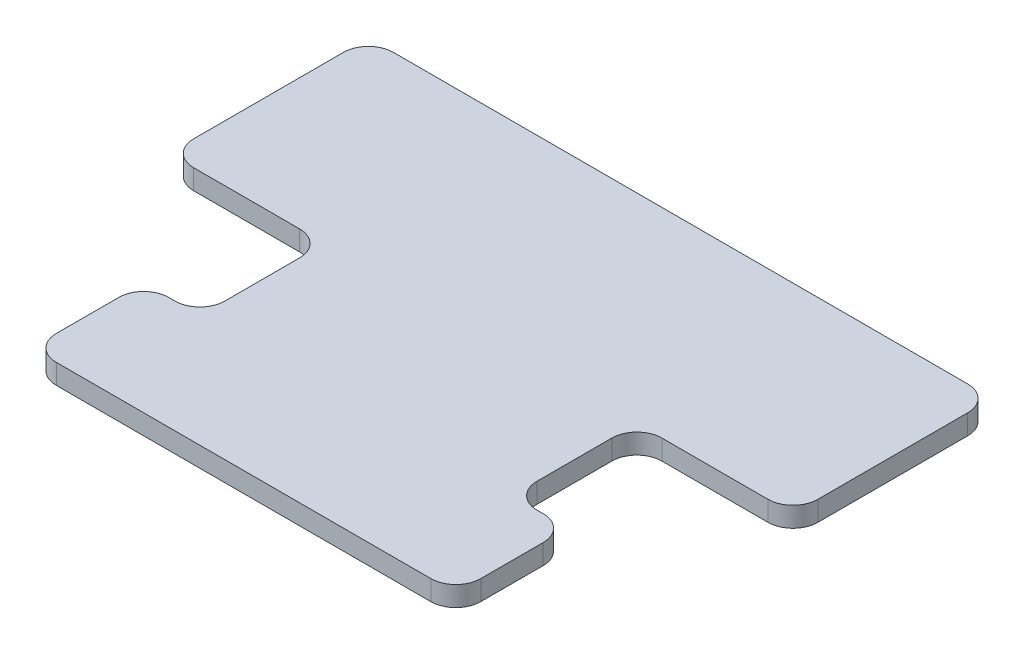
ISO-10303-21;
HEADER;
FILE_DESCRIPTION(('STEP AP214'),'2;1');
FILE_NAME('part.step','',(''),(''),'','','');
FILE_SCHEMA(('AUTOMOTIVE_DESIGN { 1 0 10303 214 1 1 1 1 }'));
ENDSEC;
DATA;
#1=APPLICATION_CONTEXT('core data for automotive mechanical design processes');
#2=APPLICATION_PROTOCOL_DEFINITION('international standard','automotive_design',2000,#1);
#3=PRODUCT_CONTEXT('',#1,'mechanical');
#4=PRODUCT('Part','Part','',(#3));
#5=PRODUCT_RELATED_PRODUCT_CATEGORY('part','',(#4));
#6=PRODUCT_DEFINITION_FORMATION('','',#4);
#7=PRODUCT_DEFINITION_CONTEXT('part definition',#1,'design');
#8=PRODUCT_DEFINITION('design','',#6,#7);
#9=PRODUCT_DEFINITION_SHAPE('','',#8);
#10=(LENGTH_UNIT() NAMED_UNIT(*) SI_UNIT(.MILLI.,.METRE.));
#11=(NAMED_UNIT(*) PLANE_ANGLE_UNIT() SI_UNIT($,.RADIAN.));
#12=(NAMED_UNIT(*) SI_UNIT($,.STERADIAN.) SOLID_ANGLE_UNIT());
#13=UNCERTAINTY_MEASURE_WITH_UNIT(LENGTH_MEASURE(1.E-05),#10,'distance_accuracy_value','');
#14=(GEOMETRIC_REPRESENTATION_CONTEXT(3) GLOBAL_UNCERTAINTY_ASSIGNED_CONTEXT((#13)) GLOBAL_UNIT_ASSIGNED_CONTEXT((#10,
#11,#12)) REPRESENTATION_CONTEXT('',''));
#15=CARTESIAN_POINT('',(0.,0.,0.));
#16=DIRECTION('',(0.,0.,1.));
#17=DIRECTION('',(1.,0.,0.));
#18=AXIS2_PLACEMENT_3D('',#15,#16,#17);
#19=CARTESIAN_POINT('',(-23.,1.6,-1.97350532717822));
#20=DIRECTION('',(0.,-1.,0.));
#21=DIRECTION('',(0.,0.,-1.));
#22=AXIS2_PLACEMENT_3D('',#19,#20,#21);
#23=CYLINDRICAL_SURFACE('',#22,2.);
#24=CARTESIAN_POINT('',(-23.,0.,-1.97350532717822));
#25=DIRECTION('',(0.,1.,0.));
#26=DIRECTION('',(0.,0.,1.));
#27=AXIS2_PLACEMENT_3D('',#24,#25,#26);
#28=CIRCLE('',#27,2.);
#29=CARTESIAN_POINT('',(-25.,0.,-1.97350532717822));
#30=VERTEX_POINT('',#29);
#31=CARTESIAN_POINT('',(-23.,0.,0.0264946728217795));
#32=VERTEX_POINT('',#31);
#33=EDGE_CURVE('E239',#30,#32,#28,.T.);
#34=ORIENTED_EDGE('',*,*,#33,.T.);
#35=DIRECTION('',(0.,-1.,0.));
#36=VECTOR('',#35,1.);
#37=CARTESIAN_POINT('',(-23.,1.6,0.0264946728217795));
#38=LINE('',#37,#36);
#39=CARTESIAN_POINT('',(-23.,1.6,0.0264946728217795));
#40=VERTEX_POINT('',#39);
#41=EDGE_CURVE('E11',#40,#32,#38,.T.);
#42=ORIENTED_EDGE('',*,*,#41,.F.);
#43=CARTESIAN_POINT('',(-23.,1.6,-1.97350532717822));
#44=DIRECTION('',(0.,1.,0.));
#45=DIRECTION('',(0.,0.,1.));
#46=AXIS2_PLACEMENT_3D('',#43,#44,#45);
#47=CIRCLE('',#46,2.);
#48=CARTESIAN_POINT('',(-25.,1.6,-1.97350532717822));
#49=VERTEX_POINT('',#48);
#50=EDGE_CURVE('E320',#49,#40,#47,.T.);
#51=ORIENTED_EDGE('',*,*,#50,.F.);
#52=DIRECTION('',(0.,-1.,0.));
#53=VECTOR('',#52,1.);
#54=CARTESIAN_POINT('',(-25.,1.6,-1.97350532717822));
#55=LINE('',#54,#53);
#56=EDGE_CURVE('E238',#49,#30,#55,.T.);
#57=ORIENTED_EDGE('',*,*,#56,.T.);
#58=EDGE_LOOP('',(#34,#42,#51,#57));
#59=FACE_BOUND('',#58,.T.);
#60=ADVANCED_FACE('F37',(#59),#23,.T.);
#61=CARTESIAN_POINT('',(-23.,1.6,0.0264946728217795));
#62=DIRECTION('',(0.,0.,-1.));
#63=DIRECTION('',(-1.,0.,0.));
#64=AXIS2_PLACEMENT_3D('',#61,#62,#63);
#65=PLANE('',#64);
#66=DIRECTION('',(1.,0.,0.));
#67=VECTOR('',#66,1.);
#68=CARTESIAN_POINT('',(-23.,0.,0.0264946728217795));
#69=LINE('',#68,#67);
#70=CARTESIAN_POINT('',(-14.5,0.,0.0264946728217793));
#71=VERTEX_POINT('',#70);
#72=EDGE_CURVE('E243',#32,#71,#69,.T.);
#73=ORIENTED_EDGE('',*,*,#72,.T.);
#74=DIRECTION('',(0.,-1.,0.));
#75=VECTOR('',#74,1.);
#76=CARTESIAN_POINT('',(-14.5,1.6,0.0264946728217793));
#77=LINE('',#76,#75);
#78=CARTESIAN_POINT('',(-14.5,1.6,0.0264946728217793));
#79=VERTEX_POINT('',#78);
#80=EDGE_CURVE('E46',#79,#71,#77,.T.);
#81=ORIENTED_EDGE('',*,*,#80,.F.);
#82=DIRECTION('',(1.,0.,0.));
#83=VECTOR('',#82,1.);
#84=CARTESIAN_POINT('',(-23.,1.6,0.0264946728217795));
#85=LINE('',#84,#83);
#86=EDGE_CURVE('E144',#40,#79,#85,.T.);
#87=ORIENTED_EDGE('',*,*,#86,.F.);
#88=ORIENTED_EDGE('',*,*,#41,.T.);
#89=EDGE_LOOP('',(#73,#81,#87,#88));
#90=FACE_BOUND('',#89,.T.);
#91=ADVANCED_FACE('F487',(#90),#65,.F.);
#92=CARTESIAN_POINT('',(-14.5,1.6,2.02649467282178));
#93=DIRECTION('',(0.,-1.,0.));
#94=DIRECTION('',(0.,0.,-1.));
#95=AXIS2_PLACEMENT_3D('',#92,#93,#94);
#96=CYLINDRICAL_SURFACE('',#95,2.);
#97=CARTESIAN_POINT('',(-14.5,0.,2.02649467282178));
#98=DIRECTION('',(0.,-1.,0.));
#99=DIRECTION('',(0.,0.,-1.));
#100=AXIS2_PLACEMENT_3D('',#97,#98,#99);
#101=CIRCLE('',#100,2.);
#102=CARTESIAN_POINT('',(-12.5,0.,2.02649467282178));
#103=VERTEX_POINT('',#102);
#104=EDGE_CURVE('E245',#71,#103,#101,.T.);
#105=ORIENTED_EDGE('',*,*,#104,.T.);
#106=DIRECTION('',(0.,-1.,0.));
#107=VECTOR('',#106,1.);
#108=CARTESIAN_POINT('',(-12.5,1.6,2.02649467282178));
#109=LINE('',#108,#107);
#110=CARTESIAN_POINT('',(-12.5,1.6,2.02649467282178));
#111=VERTEX_POINT('',#110);
#112=EDGE_CURVE('E384',#111,#103,#109,.T.);
#113=ORIENTED_EDGE('',*,*,#112,.F.);
#114=CARTESIAN_POINT('',(-14.5,1.6,2.02649467282178));
#115=DIRECTION('',(0.,-1.,0.));
#116=DIRECTION('',(0.,0.,-1.));
#117=AXIS2_PLACEMENT_3D('',#114,#115,#116);
#118=CIRCLE('',#117,2.);
#119=EDGE_CURVE('E395',#79,#111,#118,.T.);
#120=ORIENTED_EDGE('',*,*,#119,.F.);
#121=ORIENTED_EDGE('',*,*,#80,.T.);
#122=EDGE_LOOP('',(#105,#113,#120,#121));
#123=FACE_BOUND('',#122,.T.);
#124=ADVANCED_FACE('F393',(#123),#96,.F.);
#125=CARTESIAN_POINT('',(-12.5,1.6,2.02649467282178));
#126=DIRECTION('',(1.,0.,0.));
#127=DIRECTION('',(0.,0.,-1.));
#128=AXIS2_PLACEMENT_3D('',#125,#126,#127);
#129=PLANE('',#128);
#130=DIRECTION('',(0.,0.,1.));
#131=VECTOR('',#130,1.);
#132=CARTESIAN_POINT('',(-12.5,0.,2.02649467282178));
#133=LINE('',#132,#131);
#134=CARTESIAN_POINT('',(-12.5,0.,8.02649467282177));
#135=VERTEX_POINT('',#134);
#136=EDGE_CURVE('E248',#103,#135,#133,.T.);
#137=ORIENTED_EDGE('',*,*,#136,.T.);
#138=DIRECTION('',(0.,-1.,0.));
#139=VECTOR('',#138,1.);
#140=CARTESIAN_POINT('',(-12.5,1.6,8.02649467282177));
#141=LINE('',#140,#139);
#142=CARTESIAN_POINT('',(-12.5,1.6,8.02649467282177));
#143=VERTEX_POINT('',#142);
#144=EDGE_CURVE('E380',#143,#135,#141,.T.);
#145=ORIENTED_EDGE('',*,*,#144,.F.);
#146=DIRECTION('',(0.,0.,1.));
#147=VECTOR('',#146,1.);
#148=CARTESIAN_POINT('',(-12.5,1.6,2.02649467282178));
#149=LINE('',#148,#147);
#150=EDGE_CURVE('E414',#111,#143,#149,.T.);
#151=ORIENTED_EDGE('',*,*,#150,.F.);
#152=ORIENTED_EDGE('',*,*,#112,.T.);
#153=EDGE_LOOP('',(#137,#145,#151,#152));
#154=FACE_BOUND('',#153,.T.);
#155=ADVANCED_FACE('F403',(#154),#129,.F.);
#156=CARTESIAN_POINT('',(-14.5,1.6,8.02649467282178));
#157=DIRECTION('',(0.,-1.,0.));
#158=DIRECTION('',(0.,0.,-1.));
#159=AXIS2_PLACEMENT_3D('',#156,#157,#158);
#160=CYLINDRICAL_SURFACE('',#159,2.);
#161=CARTESIAN_POINT('',(-14.5,0.,8.02649467282178));
#162=DIRECTION('',(0.,-1.,0.));
#163=DIRECTION('',(0.,0.,-1.));
#164=AXIS2_PLACEMENT_3D('',#161,#162,#163);
#165=CIRCLE('',#164,2.);
#166=CARTESIAN_POINT('',(-14.5,0.,10.0264946728218));
#167=VERTEX_POINT('',#166);
#168=EDGE_CURVE('E251',#135,#167,#165,.T.);
#169=ORIENTED_EDGE('',*,*,#168,.T.);
#170=DIRECTION('',(0.,-1.,0.));
#171=VECTOR('',#170,1.);
#172=CARTESIAN_POINT('',(-14.5,1.6,10.0264946728218));
#173=LINE('',#172,#171);
#174=CARTESIAN_POINT('',(-14.5,1.6,10.0264946728218));
#175=VERTEX_POINT('',#174);
#176=EDGE_CURVE('E377',#175,#167,#173,.T.);
#177=ORIENTED_EDGE('',*,*,#176,.F.);
#178=CARTESIAN_POINT('',(-14.5,1.6,8.02649467282178));
#179=DIRECTION('',(0.,-1.,0.));
#180=DIRECTION('',(0.,0.,-1.));
#181=AXIS2_PLACEMENT_3D('',#178,#179,#180);
#182=CIRCLE('',#181,2.);
#183=EDGE_CURVE('E409',#143,#175,#182,.T.);
#184=ORIENTED_EDGE('',*,*,#183,.F.);
#185=ORIENTED_EDGE('',*,*,#144,.T.);
#186=EDGE_LOOP('',(#169,#177,#184,#185));
#187=FACE_BOUND('',#186,.T.);
#188=ADVANCED_FACE('F407',(#187),#160,.F.);
#189=CARTESIAN_POINT('',(-15.,1.6,10.0264946728218));
#190=DIRECTION('',(0.,0.,-1.));
#191=DIRECTION('',(-1.,0.,0.));
#192=AXIS2_PLACEMENT_3D('',#189,#190,#191);
#193=PLANE('',#192);
#194=DIRECTION('',(1.,0.,0.));
#195=VECTOR('',#194,1.);
#196=CARTESIAN_POINT('',(-15.,0.,10.0264946728218));
#197=LINE('',#196,#195);
#198=CARTESIAN_POINT('',(-15.,0.,10.0264946728218));
#199=VERTEX_POINT('',#198);
#200=EDGE_CURVE('E255',#199,#167,#197,.T.);
#201=ORIENTED_EDGE('',*,*,#200,.F.);
#202=DIRECTION('',(0.,-1.,0.));
#203=VECTOR('',#202,1.);
#204=CARTESIAN_POINT('',(-15.,1.6,10.0264946728218));
#205=LINE('',#204,#203);
#206=CARTESIAN_POINT('',(-15.,1.6,10.0264946728218));
#207=VERTEX_POINT('',#206);
#208=EDGE_CURVE('E374',#207,#199,#205,.T.);
#209=ORIENTED_EDGE('',*,*,#208,.F.);
#210=DIRECTION('',(1.,0.,0.));
#211=VECTOR('',#210,1.);
#212=CARTESIAN_POINT('',(-15.,1.6,10.0264946728218));
#213=LINE('',#212,#211);
#214=EDGE_CURVE('E413',#207,#175,#213,.T.);
#215=ORIENTED_EDGE('',*,*,#214,.T.);
#216=ORIENTED_EDGE('',*,*,#176,.T.);
#217=EDGE_LOOP('',(#201,#209,#215,#216));
#218=FACE_BOUND('',#217,.T.);
#219=ADVANCED_FACE('F500',(#218),#193,.T.);
#220=CARTESIAN_POINT('',(-15.,1.6,12.0264946728218));
#221=DIRECTION('',(0.,-1.,0.));
#222=DIRECTION('',(0.,0.,-1.));
#223=AXIS2_PLACEMENT_3D('',#220,#221,#222);
#224=CYLINDRICAL_SURFACE('',#223,2.);
#225=CARTESIAN_POINT('',(-15.,0.,12.0264946728218));
#226=DIRECTION('',(0.,1.,0.));
#227=DIRECTION('',(0.,0.,1.));
#228=AXIS2_PLACEMENT_3D('',#225,#226,#227);
#229=CIRCLE('',#228,2.);
#230=CARTESIAN_POINT('',(-17.,0.,12.0264946728218));
#231=VERTEX_POINT('',#230);
#232=EDGE_CURVE('E259',#199,#231,#229,.T.);
#233=ORIENTED_EDGE('',*,*,#232,.T.);
#234=DIRECTION('',(0.,-1.,0.));
#235=VECTOR('',#234,1.);
#236=CARTESIAN_POINT('',(-17.,1.6,12.0264946728218));
#237=LINE('',#236,#235);
#238=CARTESIAN_POINT('',(-17.,1.6,12.0264946728218));
#239=VERTEX_POINT('',#238);
#240=EDGE_CURVE('E370',#239,#231,#237,.T.);
#241=ORIENTED_EDGE('',*,*,#240,.F.);
#242=CARTESIAN_POINT('',(-15.,1.6,12.0264946728218));
#243=DIRECTION('',(0.,1.,0.));
#244=DIRECTION('',(0.,0.,1.));
#245=AXIS2_PLACEMENT_3D('',#242,#243,#244);
#246=CIRCLE('',#245,2.);
#247=EDGE_CURVE('E418',#207,#239,#246,.T.);
#248=ORIENTED_EDGE('',*,*,#247,.F.);
#249=ORIENTED_EDGE('',*,*,#208,.T.);
#250=EDGE_LOOP('',(#233,#241,#248,#249));
#251=FACE_BOUND('',#250,.T.);
#252=ADVANCED_FACE('F503',(#251),#224,.T.);
#253=CARTESIAN_POINT('',(-17.,1.6,12.0264946728218));
#254=DIRECTION('',(1.,0.,0.));
#255=DIRECTION('',(0.,0.,-1.));
#256=AXIS2_PLACEMENT_3D('',#253,#254,#255);
#257=PLANE('',#256);
#258=DIRECTION('',(0.,0.,1.));
#259=VECTOR('',#258,1.);
#260=CARTESIAN_POINT('',(-17.,0.,12.0264946728218));
#261=LINE('',#260,#259);
#262=CARTESIAN_POINT('',(-17.,0.,17.0264946728218));
#263=VERTEX_POINT('',#262);
#264=EDGE_CURVE('E262',#231,#263,#261,.T.);
#265=ORIENTED_EDGE('',*,*,#264,.T.);
#266=DIRECTION('',(0.,-1.,0.));
#267=VECTOR('',#266,1.);
#268=CARTESIAN_POINT('',(-17.,1.6,17.0264946728218));
#269=LINE('',#268,#267);
#270=CARTESIAN_POINT('',(-17.,1.6,17.0264946728218));
#271=VERTEX_POINT('',#270);
#272=EDGE_CURVE('E366',#271,#263,#269,.T.);
#273=ORIENTED_EDGE('',*,*,#272,.F.);
#274=DIRECTION('',(0.,0.,1.));
#275=VECTOR('',#274,1.);
#276=CARTESIAN_POINT('',(-17.,1.6,12.0264946728218));
#277=LINE('',#276,#275);
#278=EDGE_CURVE('E426',#239,#271,#277,.T.);
#279=ORIENTED_EDGE('',*,*,#278,.F.);
#280=ORIENTED_EDGE('',*,*,#240,.T.);
#281=EDGE_LOOP('',(#265,#273,#279,#280));
#282=FACE_BOUND('',#281,.T.);
#283=ADVANCED_FACE('F507',(#282),#257,.F.);
#284=CARTESIAN_POINT('',(-15.,1.6,17.0264946728218));
#285=DIRECTION('',(0.,-1.,0.));
#286=DIRECTION('',(0.,0.,-1.));
#287=AXIS2_PLACEMENT_3D('',#284,#285,#286);
#288=CYLINDRICAL_SURFACE('',#287,2.);
#289=CARTESIAN_POINT('',(-15.,0.,17.0264946728218));
#290=DIRECTION('',(0.,1.,0.));
#291=DIRECTION('',(0.,0.,1.));
#292=AXIS2_PLACEMENT_3D('',#289,#290,#291);
#293=CIRCLE('',#292,2.);
#294=CARTESIAN_POINT('',(-15.,0.,19.0264946728218));
#295=VERTEX_POINT('',#294);
#296=EDGE_CURVE('E265',#263,#295,#293,.T.);
#297=ORIENTED_EDGE('',*,*,#296,.T.);
#298=DIRECTION('',(0.,-1.,0.));
#299=VECTOR('',#298,1.);
#300=CARTESIAN_POINT('',(-15.,1.6,19.0264946728218));
#301=LINE('',#300,#299);
#302=CARTESIAN_POINT('',(-15.,1.6,19.0264946728218));
#303=VERTEX_POINT('',#302);
#304=EDGE_CURVE('E362',#303,#295,#301,.T.);
#305=ORIENTED_EDGE('',*,*,#304,.F.);
#306=CARTESIAN_POINT('',(-15.,1.6,17.0264946728218));
#307=DIRECTION('',(0.,1.,0.));
#308=DIRECTION('',(0.,0.,1.));
#309=AXIS2_PLACEMENT_3D('',#306,#307,#308);
#310=CIRCLE('',#309,2.);
#311=EDGE_CURVE('E429',#271,#303,#310,.T.);
#312=ORIENTED_EDGE('',*,*,#311,.F.);
#313=ORIENTED_EDGE('',*,*,#272,.T.);
#314=EDGE_LOOP('',(#297,#305,#312,#313));
#315=FACE_BOUND('',#314,.T.);
#316=ADVANCED_FACE('F511',(#315),#288,.T.);
#317=CARTESIAN_POINT('',(-15.,1.6,19.0264946728218));
#318=DIRECTION('',(0.,0.,-1.));
#319=DIRECTION('',(-1.,0.,0.));
#320=AXIS2_PLACEMENT_3D('',#317,#318,#319);
#321=PLANE('',#320);
#322=DIRECTION('',(1.,0.,0.));
#323=VECTOR('',#322,1.);
#324=CARTESIAN_POINT('',(-15.,0.,19.0264946728218));
#325=LINE('',#324,#323);
#326=CARTESIAN_POINT('',(15.,0.,19.0264946728218));
#327=VERTEX_POINT('',#326);
#328=EDGE_CURVE('E268',#295,#327,#325,.T.);
#329=ORIENTED_EDGE('',*,*,#328,.T.);
#330=DIRECTION('',(0.,-1.,0.));
#331=VECTOR('',#330,1.);
#332=CARTESIAN_POINT('',(15.,1.6,19.0264946728218));
#333=LINE('',#332,#331);
#334=CARTESIAN_POINT('',(15.,1.6,19.0264946728218));
#335=VERTEX_POINT('',#334);
#336=EDGE_CURVE('E358',#335,#327,#333,.T.);
#337=ORIENTED_EDGE('',*,*,#336,.F.);
#338=DIRECTION('',(1.,0.,0.));
#339=VECTOR('',#338,1.);
#340=CARTESIAN_POINT('',(-15.,1.6,19.0264946728218));
#341=LINE('',#340,#339);
#342=EDGE_CURVE('E431',#303,#335,#341,.T.);
#343=ORIENTED_EDGE('',*,*,#342,.F.);
#344=ORIENTED_EDGE('',*,*,#304,.T.);
#345=EDGE_LOOP('',(#329,#337,#343,#344));
#346=FACE_BOUND('',#345,.T.);
#347=ADVANCED_FACE('F515',(#346),#321,.F.);
#348=CARTESIAN_POINT('',(15.,1.6,17.0264946728218));
#349=DIRECTION('',(0.,-1.,0.));
#350=DIRECTION('',(0.,0.,-1.));
#351=AXIS2_PLACEMENT_3D('',#348,#349,#350);
#352=CYLINDRICAL_SURFACE('',#351,2.);
#353=CARTESIAN_POINT('',(15.,0.,17.0264946728218));
#354=DIRECTION('',(0.,1.,0.));
#355=DIRECTION('',(0.,0.,1.));
#356=AXIS2_PLACEMENT_3D('',#353,#354,#355);
#357=CIRCLE('',#356,2.);
#358=CARTESIAN_POINT('',(17.,0.,17.0264946728218));
#359=VERTEX_POINT('',#358);
#360=EDGE_CURVE('E271',#327,#359,#357,.T.);
#361=ORIENTED_EDGE('',*,*,#360,.T.);
#362=DIRECTION('',(0.,-1.,0.));
#363=VECTOR('',#362,1.);
#364=CARTESIAN_POINT('',(17.,1.6,17.0264946728218));
#365=LINE('',#364,#363);
#366=CARTESIAN_POINT('',(17.,1.6,17.0264946728218));
#367=VERTEX_POINT('',#366);
#368=EDGE_CURVE('E355',#367,#359,#365,.T.);
#369=ORIENTED_EDGE('',*,*,#368,.F.);
#370=CARTESIAN_POINT('',(15.,1.6,17.0264946728218));
#371=DIRECTION('',(0.,1.,0.));
#372=DIRECTION('',(0.,0.,1.));
#373=AXIS2_PLACEMENT_3D('',#370,#371,#372);
#374=CIRCLE('',#373,2.);
#375=EDGE_CURVE('E434',#335,#367,#374,.T.);
#376=ORIENTED_EDGE('',*,*,#375,.F.);
#377=ORIENTED_EDGE('',*,*,#336,.T.);
#378=EDGE_LOOP('',(#361,#369,#376,#377));
#379=FACE_BOUND('',#378,.T.);
#380=ADVANCED_FACE('F519',(#379),#352,.T.);
#381=CARTESIAN_POINT('',(17.,1.6,12.0264946728218));
#382=DIRECTION('',(1.,0.,0.));
#383=DIRECTION('',(0.,0.,-1.));
#384=AXIS2_PLACEMENT_3D('',#381,#382,#383);
#385=PLANE('',#384);
#386=DIRECTION('',(0.,0.,1.));
#387=VECTOR('',#386,1.);
#388=CARTESIAN_POINT('',(17.,0.,12.0264946728218));
#389=LINE('',#388,#387);
#390=CARTESIAN_POINT('',(17.,0.,12.0264946728218));
#391=VERTEX_POINT('',#390);
#392=EDGE_CURVE('E275',#391,#359,#389,.T.);
#393=ORIENTED_EDGE('',*,*,#392,.F.);
#394=DIRECTION('',(0.,-1.,0.));
#395=VECTOR('',#394,1.);
#396=CARTESIAN_POINT('',(17.,1.6,12.0264946728218));
#397=LINE('',#396,#395);
#398=CARTESIAN_POINT('',(17.,1.6,12.0264946728218));
#399=VERTEX_POINT('',#398);
#400=EDGE_CURVE('E352',#399,#391,#397,.T.);
#401=ORIENTED_EDGE('',*,*,#400,.F.);
#402=DIRECTION('',(0.,0.,1.));
#403=VECTOR('',#402,1.);
#404=CARTESIAN_POINT('',(17.,1.6,12.0264946728218));
#405=LINE('',#404,#403);
#406=EDGE_CURVE('E437',#399,#367,#405,.T.);
#407=ORIENTED_EDGE('',*,*,#406,.T.);
#408=ORIENTED_EDGE('',*,*,#368,.T.);
#409=EDGE_LOOP('',(#393,#401,#407,#408));
#410=FACE_BOUND('',#409,.T.);
#411=ADVANCED_FACE('F523',(#410),#385,.T.);
#412=CARTESIAN_POINT('',(15.,1.6,12.0264946728218));
#413=DIRECTION('',(0.,-1.,0.));
#414=DIRECTION('',(0.,0.,-1.));
#415=AXIS2_PLACEMENT_3D('',#412,#413,#414);
#416=CYLINDRICAL_SURFACE('',#415,2.);
#417=CARTESIAN_POINT('',(15.,0.,12.0264946728218));
#418=DIRECTION('',(0.,-1.,0.));
#419=DIRECTION('',(0.,0.,-1.));
#420=AXIS2_PLACEMENT_3D('',#417,#418,#419);
#421=CIRCLE('',#420,2.);
#422=CARTESIAN_POINT('',(15.,0.,10.0264946728218));
#423=VERTEX_POINT('',#422);
#424=EDGE_CURVE('E279',#423,#391,#421,.T.);
#425=ORIENTED_EDGE('',*,*,#424,.F.);
#426=DIRECTION('',(0.,-1.,0.));
#427=VECTOR('',#426,1.);
#428=CARTESIAN_POINT('',(15.,1.6,10.0264946728218));
#429=LINE('',#428,#427);
#430=CARTESIAN_POINT('',(15.,1.6,10.0264946728218));
#431=VERTEX_POINT('',#430);
#432=EDGE_CURVE('E349',#431,#423,#429,.T.);
#433=ORIENTED_EDGE('',*,*,#432,.F.);
#434=CARTESIAN_POINT('',(15.,1.6,12.0264946728218));
#435=DIRECTION('',(0.,-1.,0.));
#436=DIRECTION('',(0.,0.,-1.));
#437=AXIS2_PLACEMENT_3D('',#434,#435,#436);
#438=CIRCLE('',#437,2.);
#439=EDGE_CURVE('E441',#431,#399,#438,.T.);
#440=ORIENTED_EDGE('',*,*,#439,.T.);
#441=ORIENTED_EDGE('',*,*,#400,.T.);
#442=EDGE_LOOP('',(#425,#433,#440,#441));
#443=FACE_BOUND('',#442,.T.);
#444=ADVANCED_FACE('F527',(#443),#416,.T.);
#445=CARTESIAN_POINT('',(14.5,1.6,10.0264946728218));
#446=DIRECTION('',(0.,0.,-1.));
#447=DIRECTION('',(-1.,0.,0.));
#448=AXIS2_PLACEMENT_3D('',#445,#446,#447);
#449=PLANE('',#448);
#450=DIRECTION('',(1.,0.,0.));
#451=VECTOR('',#450,1.);
#452=CARTESIAN_POINT('',(14.5,0.,10.0264946728218));
#453=LINE('',#452,#451);
#454=CARTESIAN_POINT('',(14.5,0.,10.0264946728218));
#455=VERTEX_POINT('',#454);
#456=EDGE_CURVE('E283',#455,#423,#453,.T.);
#457=ORIENTED_EDGE('',*,*,#456,.F.);
#458=DIRECTION('',(0.,-1.,0.));
#459=VECTOR('',#458,1.);
#460=CARTESIAN_POINT('',(14.5,1.6,10.0264946728218));
#461=LINE('',#460,#459);
#462=CARTESIAN_POINT('',(14.5,1.6,10.0264946728218));
#463=VERTEX_POINT('',#462);
#464=EDGE_CURVE('E346',#463,#455,#461,.T.);
#465=ORIENTED_EDGE('',*,*,#464,.F.);
#466=DIRECTION('',(1.,0.,0.));
#467=VECTOR('',#466,1.);
#468=CARTESIAN_POINT('',(14.5,1.6,10.0264946728218));
#469=LINE('',#468,#467);
#470=EDGE_CURVE('E445',#463,#431,#469,.T.);
#471=ORIENTED_EDGE('',*,*,#470,.T.);
#472=ORIENTED_EDGE('',*,*,#432,.T.);
#473=EDGE_LOOP('',(#457,#465,#471,#472));
#474=FACE_BOUND('',#473,.T.);
#475=ADVANCED_FACE('F531',(#474),#449,.T.);
#476=CARTESIAN_POINT('',(14.5,1.6,8.02649467282178));
#477=DIRECTION('',(0.,-1.,0.));
#478=DIRECTION('',(0.,0.,-1.));
#479=AXIS2_PLACEMENT_3D('',#476,#477,#478);
#480=CYLINDRICAL_SURFACE('',#479,2.);
#481=CARTESIAN_POINT('',(14.5,0.,8.02649467282178));
#482=DIRECTION('',(0.,-1.,0.));
#483=DIRECTION('',(0.,0.,-1.));
#484=AXIS2_PLACEMENT_3D('',#481,#482,#483);
#485=CIRCLE('',#484,2.);
#486=CARTESIAN_POINT('',(12.5,0.,8.02649467282178));
#487=VERTEX_POINT('',#486);
#488=EDGE_CURVE('E287',#455,#487,#485,.T.);
#489=ORIENTED_EDGE('',*,*,#488,.T.);
#490=DIRECTION('',(0.,-1.,0.));
#491=VECTOR('',#490,1.);
#492=CARTESIAN_POINT('',(12.5,1.6,8.02649467282178));
#493=LINE('',#492,#491);
#494=CARTESIAN_POINT('',(12.5,1.6,8.02649467282178));
#495=VERTEX_POINT('',#494);
#496=EDGE_CURVE('E343',#495,#487,#493,.T.);
#497=ORIENTED_EDGE('',*,*,#496,.F.);
#498=CARTESIAN_POINT('',(14.5,1.6,8.02649467282178));
#499=DIRECTION('',(0.,-1.,0.));
#500=DIRECTION('',(0.,0.,-1.));
#501=AXIS2_PLACEMENT_3D('',#498,#499,#500);
#502=CIRCLE('',#501,2.);
#503=EDGE_CURVE('E448',#463,#495,#502,.T.);
#504=ORIENTED_EDGE('',*,*,#503,.F.);
#505=ORIENTED_EDGE('',*,*,#464,.T.);
#506=EDGE_LOOP('',(#489,#497,#504,#505));
#507=FACE_BOUND('',#506,.T.);
#508=ADVANCED_FACE('F535',(#507),#480,.F.);
#509=CARTESIAN_POINT('',(12.5,1.6,2.02649467282178));
#510=DIRECTION('',(1.,0.,0.));
#511=DIRECTION('',(0.,0.,-1.));
#512=AXIS2_PLACEMENT_3D('',#509,#510,#511);
#513=PLANE('',#512);
#514=DIRECTION('',(0.,0.,1.));
#515=VECTOR('',#514,1.);
#516=CARTESIAN_POINT('',(12.5,0.,2.02649467282178));
#517=LINE('',#516,#515);
#518=CARTESIAN_POINT('',(12.5,0.,2.02649467282178));
#519=VERTEX_POINT('',#518);
#520=EDGE_CURVE('E291',#519,#487,#517,.T.);
#521=ORIENTED_EDGE('',*,*,#520,.F.);
#522=DIRECTION('',(0.,-1.,0.));
#523=VECTOR('',#522,1.);
#524=CARTESIAN_POINT('',(12.5,1.6,2.02649467282178));
#525=LINE('',#524,#523);
#526=CARTESIAN_POINT('',(12.5,1.6,2.02649467282178));
#527=VERTEX_POINT('',#526);
#528=EDGE_CURVE('E340',#527,#519,#525,.T.);
#529=ORIENTED_EDGE('',*,*,#528,.F.);
#530=DIRECTION('',(0.,0.,1.));
#531=VECTOR('',#530,1.);
#532=CARTESIAN_POINT('',(12.5,1.6,2.02649467282178));
#533=LINE('',#532,#531);
#534=EDGE_CURVE('E451',#527,#495,#533,.T.);
#535=ORIENTED_EDGE('',*,*,#534,.T.);
#536=ORIENTED_EDGE('',*,*,#496,.T.);
#537=EDGE_LOOP('',(#521,#529,#535,#536));
#538=FACE_BOUND('',#537,.T.);
#539=ADVANCED_FACE('F539',(#538),#513,.T.);
#540=CARTESIAN_POINT('',(14.5,1.6,2.02649467282178));
#541=DIRECTION('',(0.,-1.,0.));
#542=DIRECTION('',(0.,0.,-1.));
#543=AXIS2_PLACEMENT_3D('',#540,#541,#542);
#544=CYLINDRICAL_SURFACE('',#543,2.);
#545=CARTESIAN_POINT('',(14.5,0.,2.02649467282178));
#546=DIRECTION('',(0.,1.,0.));
#547=DIRECTION('',(0.,0.,1.));
#548=AXIS2_PLACEMENT_3D('',#545,#546,#547);
#549=CIRCLE('',#548,2.);
#550=CARTESIAN_POINT('',(14.5,0.,0.0264946728217785));
#551=VERTEX_POINT('',#550);
#552=EDGE_CURVE('E295',#551,#519,#549,.T.);
#553=ORIENTED_EDGE('',*,*,#552,.F.);
#554=DIRECTION('',(0.,-1.,0.));
#555=VECTOR('',#554,1.);
#556=CARTESIAN_POINT('',(14.5,1.6,0.0264946728217785));
#557=LINE('',#556,#555);
#558=CARTESIAN_POINT('',(14.5,1.6,0.0264946728217785));
#559=VERTEX_POINT('',#558);
#560=EDGE_CURVE('E337',#559,#551,#557,.T.);
#561=ORIENTED_EDGE('',*,*,#560,.F.);
#562=CARTESIAN_POINT('',(14.5,1.6,2.02649467282178));
#563=DIRECTION('',(0.,1.,0.));
#564=DIRECTION('',(0.,0.,1.));
#565=AXIS2_PLACEMENT_3D('',#562,#563,#564);
#566=CIRCLE('',#565,2.);
#567=EDGE_CURVE('E454',#559,#527,#566,.T.);
#568=ORIENTED_EDGE('',*,*,#567,.T.);
#569=ORIENTED_EDGE('',*,*,#528,.T.);
#570=EDGE_LOOP('',(#553,#561,#568,#569));
#571=FACE_BOUND('',#570,.T.);
#572=ADVANCED_FACE('F543',(#571),#544,.F.);
#573=CARTESIAN_POINT('',(14.5,1.6,0.0264946728217794));
#574=DIRECTION('',(0.,0.,-1.));
#575=DIRECTION('',(-1.,0.,0.));
#576=AXIS2_PLACEMENT_3D('',#573,#574,#575);
#577=PLANE('',#576);
#578=DIRECTION('',(1.,0.,0.));
#579=VECTOR('',#578,1.);
#580=CARTESIAN_POINT('',(14.5,0.,0.0264946728217794));
#581=LINE('',#580,#579);
#582=CARTESIAN_POINT('',(23.,0.,0.0264946728217794));
#583=VERTEX_POINT('',#582);
#584=EDGE_CURVE('E299',#551,#583,#581,.T.);
#585=ORIENTED_EDGE('',*,*,#584,.T.);
#586=DIRECTION('',(0.,-1.,0.));
#587=VECTOR('',#586,1.);
#588=CARTESIAN_POINT('',(23.,1.6,0.0264946728217794));
#589=LINE('',#588,#587);
#590=CARTESIAN_POINT('',(23.,1.6,0.0264946728217794));
#591=VERTEX_POINT('',#590);
#592=EDGE_CURVE('E333',#591,#583,#589,.T.);
#593=ORIENTED_EDGE('',*,*,#592,.F.);
#594=DIRECTION('',(1.,0.,0.));
#595=VECTOR('',#594,1.);
#596=CARTESIAN_POINT('',(14.5,1.6,0.0264946728217794));
#597=LINE('',#596,#595);
#598=EDGE_CURVE('E458',#559,#591,#597,.T.);
#599=ORIENTED_EDGE('',*,*,#598,.F.);
#600=ORIENTED_EDGE('',*,*,#560,.T.);
#601=EDGE_LOOP('',(#585,#593,#599,#600));
#602=FACE_BOUND('',#601,.T.);
#603=ADVANCED_FACE('F547',(#602),#577,.F.);
#604=CARTESIAN_POINT('',(23.,1.6,-1.97350532717822));
#605=DIRECTION('',(0.,-1.,0.));
#606=DIRECTION('',(0.,0.,-1.));
#607=AXIS2_PLACEMENT_3D('',#604,#605,#606);
#608=CYLINDRICAL_SURFACE('',#607,2.);
#609=CARTESIAN_POINT('',(23.,0.,-1.97350532717822));
#610=DIRECTION('',(0.,1.,0.));
#611=DIRECTION('',(0.,0.,1.));
#612=AXIS2_PLACEMENT_3D('',#609,#610,#611);
#613=CIRCLE('',#612,2.);
#614=CARTESIAN_POINT('',(25.,0.,-1.97350532717822));
#615=VERTEX_POINT('',#614);
#616=EDGE_CURVE('E302',#583,#615,#613,.T.);
#617=ORIENTED_EDGE('',*,*,#616,.T.);
#618=DIRECTION('',(0.,-1.,0.));
#619=VECTOR('',#618,1.);
#620=CARTESIAN_POINT('',(25.,1.6,-1.97350532717822));
#621=LINE('',#620,#619);
#622=CARTESIAN_POINT('',(25.,1.6,-1.97350532717822));
#623=VERTEX_POINT('',#622);
#624=EDGE_CURVE('E330',#623,#615,#621,.T.);
#625=ORIENTED_EDGE('',*,*,#624,.F.);
#626=CARTESIAN_POINT('',(23.,1.6,-1.97350532717822));
#627=DIRECTION('',(0.,1.,0.));
#628=DIRECTION('',(0.,0.,1.));
#629=AXIS2_PLACEMENT_3D('',#626,#627,#628);
#630=CIRCLE('',#629,2.);
#631=EDGE_CURVE('E461',#591,#623,#630,.T.);
#632=ORIENTED_EDGE('',*,*,#631,.F.);
#633=ORIENTED_EDGE('',*,*,#592,.T.);
#634=EDGE_LOOP('',(#617,#625,#632,#633));
#635=FACE_BOUND('',#634,.T.);
#636=ADVANCED_FACE('F551',(#635),#608,.T.);
#637=CARTESIAN_POINT('',(25.,1.6,-13.9735053271782));
#638=DIRECTION('',(1.,0.,0.));
#639=DIRECTION('',(0.,0.,-1.));
#640=AXIS2_PLACEMENT_3D('',#637,#638,#639);
#641=PLANE('',#640);
#642=DIRECTION('',(0.,0.,1.));
#643=VECTOR('',#642,1.);
#644=CARTESIAN_POINT('',(25.,0.,-13.9735053271782));
#645=LINE('',#644,#643);
#646=CARTESIAN_POINT('',(25.,0.,-13.9735053271782));
#647=VERTEX_POINT('',#646);
#648=EDGE_CURVE('E306',#647,#615,#645,.T.);
#649=ORIENTED_EDGE('',*,*,#648,.F.);
#650=DIRECTION('',(0.,-1.,0.));
#651=VECTOR('',#650,1.);
#652=CARTESIAN_POINT('',(25.,1.6,-13.9735053271782));
#653=LINE('',#652,#651);
#654=CARTESIAN_POINT('',(25.,1.6,-13.9735053271782));
#655=VERTEX_POINT('',#654);
#656=EDGE_CURVE('E327',#655,#647,#653,.T.);
#657=ORIENTED_EDGE('',*,*,#656,.F.);
#658=DIRECTION('',(0.,0.,1.));
#659=VECTOR('',#658,1.);
#660=CARTESIAN_POINT('',(25.,1.6,-13.9735053271782));
#661=LINE('',#660,#659);
#662=EDGE_CURVE('E232',#655,#623,#661,.T.);
#663=ORIENTED_EDGE('',*,*,#662,.T.);
#664=ORIENTED_EDGE('',*,*,#624,.T.);
#665=EDGE_LOOP('',(#649,#657,#663,#664));
#666=FACE_BOUND('',#665,.T.);
#667=ADVANCED_FACE('F467',(#666),#641,.T.);
#668=CARTESIAN_POINT('',(23.,1.6,-13.9735053271782));
#669=DIRECTION('',(0.,-1.,0.));
#670=DIRECTION('',(0.,0.,-1.));
#671=AXIS2_PLACEMENT_3D('',#668,#669,#670);
#672=CYLINDRICAL_SURFACE('',#671,2.);
#673=CARTESIAN_POINT('',(23.,0.,-13.9735053271782));
#674=DIRECTION('',(0.,-1.,0.));
#675=DIRECTION('',(0.,0.,-1.));
#676=AXIS2_PLACEMENT_3D('',#673,#674,#675);
#677=CIRCLE('',#676,2.);
#678=CARTESIAN_POINT('',(23.,0.,-15.9735053271782));
#679=VERTEX_POINT('',#678);
#680=EDGE_CURVE('E310',#679,#647,#677,.T.);
#681=ORIENTED_EDGE('',*,*,#680,.F.);
#682=DIRECTION('',(0.,-1.,0.));
#683=VECTOR('',#682,1.);
#684=CARTESIAN_POINT('',(23.,1.6,-15.9735053271782));
#685=LINE('',#684,#683);
#686=CARTESIAN_POINT('',(23.,1.6,-15.9735053271782));
#687=VERTEX_POINT('',#686);
#688=EDGE_CURVE('E215',#687,#679,#685,.T.);
#689=ORIENTED_EDGE('',*,*,#688,.F.);
#690=CARTESIAN_POINT('',(23.,1.6,-13.9735053271782));
#691=DIRECTION('',(0.,-1.,0.));
#692=DIRECTION('',(0.,0.,-1.));
#693=AXIS2_PLACEMENT_3D('',#690,#691,#692);
#694=CIRCLE('',#693,2.);
#695=EDGE_CURVE('E226',#687,#655,#694,.T.);
#696=ORIENTED_EDGE('',*,*,#695,.T.);
#697=ORIENTED_EDGE('',*,*,#656,.T.);
#698=EDGE_LOOP('',(#681,#689,#696,#697));
#699=FACE_BOUND('',#698,.T.);
#700=ADVANCED_FACE('F472',(#699),#672,.T.);
#701=CARTESIAN_POINT('',(-23.,1.6,-15.9735053271782));
#702=DIRECTION('',(0.,0.,-1.));
#703=DIRECTION('',(-1.,0.,0.));
#704=AXIS2_PLACEMENT_3D('',#701,#702,#703);
#705=PLANE('',#704);
#706=DIRECTION('',(1.,0.,0.));
#707=VECTOR('',#706,1.);
#708=CARTESIAN_POINT('',(-23.,0.,-15.9735053271782));
#709=LINE('',#708,#707);
#710=CARTESIAN_POINT('',(-23.,0.,-15.9735053271782));
#711=VERTEX_POINT('',#710);
#712=EDGE_CURVE('E213',#711,#679,#709,.T.);
#713=ORIENTED_EDGE('',*,*,#712,.F.);
#714=DIRECTION('',(0.,-1.,0.));
#715=VECTOR('',#714,1.);
#716=CARTESIAN_POINT('',(-23.,1.6,-15.9735053271782));
#717=LINE('',#716,#715);
#718=CARTESIAN_POINT('',(-23.,1.6,-15.9735053271782));
#719=VERTEX_POINT('',#718);
#720=EDGE_CURVE('E207',#719,#711,#717,.T.);
#721=ORIENTED_EDGE('',*,*,#720,.F.);
#722=DIRECTION('',(1.,0.,0.));
#723=VECTOR('',#722,1.);
#724=CARTESIAN_POINT('',(-23.,1.6,-15.9735053271782));
#725=LINE('',#724,#723);
#726=EDGE_CURVE('E211',#719,#687,#725,.T.);
#727=ORIENTED_EDGE('',*,*,#726,.T.);
#728=ORIENTED_EDGE('',*,*,#688,.T.);
#729=EDGE_LOOP('',(#713,#721,#727,#728));
#730=FACE_BOUND('',#729,.T.);
#731=ADVANCED_FACE('F209',(#730),#705,.T.);
#732=CARTESIAN_POINT('',(-23.,1.6,-13.9735053271782));
#733=DIRECTION('',(0.,-1.,0.));
#734=DIRECTION('',(0.,0.,-1.));
#735=AXIS2_PLACEMENT_3D('',#732,#733,#734);
#736=CYLINDRICAL_SURFACE('',#735,2.);
#737=CARTESIAN_POINT('',(-23.,0.,-13.9735053271782));
#738=DIRECTION('',(0.,1.,0.));
#739=DIRECTION('',(0.,0.,1.));
#740=AXIS2_PLACEMENT_3D('',#737,#738,#739);
#741=CIRCLE('',#740,2.);
#742=CARTESIAN_POINT('',(-25.,0.,-13.9735053271782));
#743=VERTEX_POINT('',#742);
#744=EDGE_CURVE('E130',#711,#743,#741,.T.);
#745=ORIENTED_EDGE('',*,*,#744,.T.);
#746=DIRECTION('',(0.,-1.,0.));
#747=VECTOR('',#746,1.);
#748=CARTESIAN_POINT('',(-25.,1.6,-13.9735053271782));
#749=LINE('',#748,#747);
#750=CARTESIAN_POINT('',(-25.,1.6,-13.9735053271782));
#751=VERTEX_POINT('',#750);
#752=EDGE_CURVE('E216',#751,#743,#749,.T.);
#753=ORIENTED_EDGE('',*,*,#752,.F.);
#754=CARTESIAN_POINT('',(-23.,1.6,-13.9735053271782));
#755=DIRECTION('',(0.,1.,0.));
#756=DIRECTION('',(0.,0.,1.));
#757=AXIS2_PLACEMENT_3D('',#754,#755,#756);
#758=CIRCLE('',#757,2.);
#759=EDGE_CURVE('E218',#719,#751,#758,.T.);
#760=ORIENTED_EDGE('',*,*,#759,.F.);
#761=ORIENTED_EDGE('',*,*,#720,.T.);
#762=EDGE_LOOP('',(#745,#753,#760,#761));
#763=FACE_BOUND('',#762,.T.);
#764=ADVANCED_FACE('F219',(#763),#736,.T.);
#765=CARTESIAN_POINT('',(-25.,1.6,-13.9735053271782));
#766=DIRECTION('',(1.,0.,0.));
#767=DIRECTION('',(0.,0.,-1.));
#768=AXIS2_PLACEMENT_3D('',#765,#766,#767);
#769=PLANE('',#768);
#770=DIRECTION('',(0.,0.,1.));
#771=VECTOR('',#770,1.);
#772=CARTESIAN_POINT('',(-25.,0.,-13.9735053271782));
#773=LINE('',#772,#771);
#774=EDGE_CURVE('E136',#743,#30,#773,.T.);
#775=ORIENTED_EDGE('',*,*,#774,.T.);
#776=ORIENTED_EDGE('',*,*,#56,.F.);
#777=DIRECTION('',(0.,0.,1.));
#778=VECTOR('',#777,1.);
#779=CARTESIAN_POINT('',(-25.,1.6,-13.9735053271782));
#780=LINE('',#779,#778);
#781=EDGE_CURVE('E54',#751,#49,#780,.T.);
#782=ORIENTED_EDGE('',*,*,#781,.F.);
#783=ORIENTED_EDGE('',*,*,#752,.T.);
#784=EDGE_LOOP('',(#775,#776,#782,#783));
#785=FACE_BOUND('',#784,.T.);
#786=ADVANCED_FACE('F476',(#785),#769,.F.);
#787=CARTESIAN_POINT('',(-23.,1.6,-1.97350532717822));
#788=DIRECTION('',(0.,1.,0.));
#789=DIRECTION('',(0.,0.,1.));
#790=AXIS2_PLACEMENT_3D('',#787,#788,#789);
#791=PLANE('',#790);
#792=ORIENTED_EDGE('',*,*,#50,.T.);
#793=ORIENTED_EDGE('',*,*,#86,.T.);
#794=ORIENTED_EDGE('',*,*,#119,.T.);
#795=ORIENTED_EDGE('',*,*,#150,.T.);
#796=ORIENTED_EDGE('',*,*,#183,.T.);
#797=ORIENTED_EDGE('',*,*,#214,.F.);
#798=ORIENTED_EDGE('',*,*,#247,.T.);
#799=ORIENTED_EDGE('',*,*,#278,.T.);
#800=ORIENTED_EDGE('',*,*,#311,.T.);
#801=ORIENTED_EDGE('',*,*,#342,.T.);
#802=ORIENTED_EDGE('',*,*,#375,.T.);
#803=ORIENTED_EDGE('',*,*,#406,.F.);
#804=ORIENTED_EDGE('',*,*,#439,.F.);
#805=ORIENTED_EDGE('',*,*,#470,.F.);
#806=ORIENTED_EDGE('',*,*,#503,.T.);
#807=ORIENTED_EDGE('',*,*,#534,.F.);
#808=ORIENTED_EDGE('',*,*,#567,.F.);
#809=ORIENTED_EDGE('',*,*,#598,.T.);
#810=ORIENTED_EDGE('',*,*,#631,.T.);
#811=ORIENTED_EDGE('',*,*,#662,.F.);
#812=ORIENTED_EDGE('',*,*,#695,.F.);
#813=ORIENTED_EDGE('',*,*,#726,.F.);
#814=ORIENTED_EDGE('',*,*,#759,.T.);
#815=ORIENTED_EDGE('',*,*,#781,.T.);
#816=EDGE_LOOP('',(#792,#793,#794,#795,#796,#797,#798,#799,#800,#801,#802,#803,#804,#805,#806,
#807,#808,#809,#810,#811,#812,#813,#814,#815));
#817=FACE_BOUND('',#816,.T.);
#818=ADVANCED_FACE('F223',(#817),#791,.T.);
#819=CARTESIAN_POINT('',(-23.,0.,-1.97350532717822));
#820=DIRECTION('',(0.,1.,0.));
#821=DIRECTION('',(0.,0.,1.));
#822=AXIS2_PLACEMENT_3D('',#819,#820,#821);
#823=PLANE('',#822);
#824=ORIENTED_EDGE('',*,*,#33,.F.);
#825=ORIENTED_EDGE('',*,*,#774,.F.);
#826=ORIENTED_EDGE('',*,*,#744,.F.);
#827=ORIENTED_EDGE('',*,*,#712,.T.);
#828=ORIENTED_EDGE('',*,*,#680,.T.);
#829=ORIENTED_EDGE('',*,*,#648,.T.);
#830=ORIENTED_EDGE('',*,*,#616,.F.);
#831=ORIENTED_EDGE('',*,*,#584,.F.);
#832=ORIENTED_EDGE('',*,*,#552,.T.);
#833=ORIENTED_EDGE('',*,*,#520,.T.);
#834=ORIENTED_EDGE('',*,*,#488,.F.);
#835=ORIENTED_EDGE('',*,*,#456,.T.);
#836=ORIENTED_EDGE('',*,*,#424,.T.);
#837=ORIENTED_EDGE('',*,*,#392,.T.);
#838=ORIENTED_EDGE('',*,*,#360,.F.);
#839=ORIENTED_EDGE('',*,*,#328,.F.);
#840=ORIENTED_EDGE('',*,*,#296,.F.);
#841=ORIENTED_EDGE('',*,*,#264,.F.);
#842=ORIENTED_EDGE('',*,*,#232,.F.);
#843=ORIENTED_EDGE('',*,*,#200,.T.);
#844=ORIENTED_EDGE('',*,*,#168,.F.);
#845=ORIENTED_EDGE('',*,*,#136,.F.);
#846=ORIENTED_EDGE('',*,*,#104,.F.);
#847=ORIENTED_EDGE('',*,*,#72,.F.);
#848=EDGE_LOOP('',(#824,#825,#826,#827,#828,#829,#830,#831,#832,#833,#834,#835,#836,#837,#838,
#839,#840,#841,#842,#843,#844,#845,#846,#847));
#849=FACE_BOUND('',#848,.T.);
#850=ADVANCED_FACE('F399',(#849),#823,.F.);
#851=CLOSED_SHELL('',(#60,#91,#124,#155,#188,#219,#252,#283,#316,#347,#380,#411,#444,#475,#508,
#539,#572,#603,#636,#667,#700,#731,#764,#786,#818,#850));
#852=MANIFOLD_SOLID_BREP('B2',#851);
#853=ADVANCED_BREP_SHAPE_REPRESENTATION('',(#18,#852),#14);
#854=SHAPE_DEFINITION_REPRESENTATION(#9,#853);
ENDSEC;
END-ISO-10303-21;
